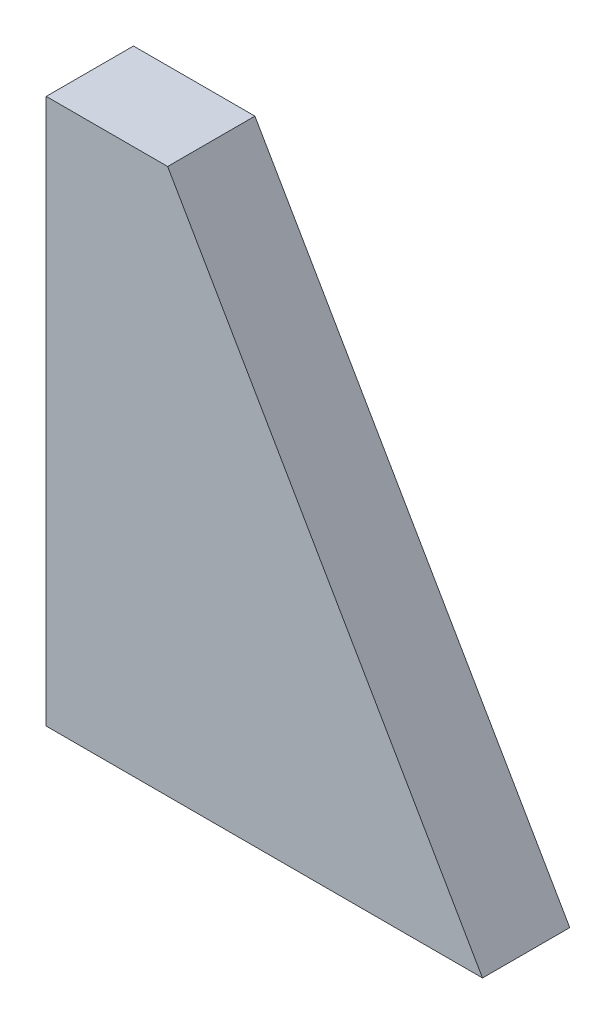
ISO-10303-21;
HEADER;
FILE_DESCRIPTION(('STEP AP214'),'2;1');
FILE_NAME('part.step','',(''),(''),'','','');
FILE_SCHEMA(('AUTOMOTIVE_DESIGN { 1 0 10303 214 1 1 1 1 }'));
ENDSEC;
DATA;
#1=APPLICATION_CONTEXT('core data for automotive mechanical design processes');
#2=APPLICATION_PROTOCOL_DEFINITION('international standard','automotive_design',2000,#1);
#3=PRODUCT_CONTEXT('',#1,'mechanical');
#4=PRODUCT('Part','Part','',(#3));
#5=PRODUCT_RELATED_PRODUCT_CATEGORY('part','',(#4));
#6=PRODUCT_DEFINITION_FORMATION('','',#4);
#7=PRODUCT_DEFINITION_CONTEXT('part definition',#1,'design');
#8=PRODUCT_DEFINITION('design','',#6,#7);
#9=PRODUCT_DEFINITION_SHAPE('','',#8);
#10=(LENGTH_UNIT() NAMED_UNIT(*) SI_UNIT(.MILLI.,.METRE.));
#11=(NAMED_UNIT(*) PLANE_ANGLE_UNIT() SI_UNIT($,.RADIAN.));
#12=(NAMED_UNIT(*) SI_UNIT($,.STERADIAN.) SOLID_ANGLE_UNIT());
#13=UNCERTAINTY_MEASURE_WITH_UNIT(LENGTH_MEASURE(1.E-05),#10,'distance_accuracy_value','');
#14=(GEOMETRIC_REPRESENTATION_CONTEXT(3) GLOBAL_UNCERTAINTY_ASSIGNED_CONTEXT((#13)) GLOBAL_UNIT_ASSIGNED_CONTEXT((#10,
#11,#12)) REPRESENTATION_CONTEXT('',''));
#15=CARTESIAN_POINT('',(0.,0.,0.));
#16=DIRECTION('',(0.,0.,1.));
#17=DIRECTION('',(1.,0.,0.));
#18=AXIS2_PLACEMENT_3D('',#15,#16,#17);
#19=CARTESIAN_POINT('',(0.,25.,8.));
#20=DIRECTION('',(0.,1.,0.));
#21=DIRECTION('',(0.,0.,1.));
#22=AXIS2_PLACEMENT_3D('',#19,#20,#21);
#23=PLANE('',#22);
#24=DIRECTION('',(1.,0.,0.));
#25=VECTOR('',#24,1.);
#26=CARTESIAN_POINT('',(0.,25.,0.));
#27=LINE('',#26,#25);
#28=CARTESIAN_POINT('',(-20.,25.,0.));
#29=VERTEX_POINT('',#28);
#30=CARTESIAN_POINT('',(-8.86751345948268,25.,0.));
#31=VERTEX_POINT('',#30);
#32=EDGE_CURVE('E98',#29,#31,#27,.T.);
#33=ORIENTED_EDGE('',*,*,#32,.F.);
#34=DIRECTION('',(0.,0.,-1.));
#35=VECTOR('',#34,1.);
#36=CARTESIAN_POINT('',(-20.,25.,8.));
#37=LINE('',#36,#35);
#38=CARTESIAN_POINT('',(-20.,25.,8.));
#39=VERTEX_POINT('',#38);
#40=EDGE_CURVE('E11',#39,#29,#37,.T.);
#41=ORIENTED_EDGE('',*,*,#40,.F.);
#42=DIRECTION('',(1.,0.,0.));
#43=VECTOR('',#42,1.);
#44=CARTESIAN_POINT('',(0.,25.,8.));
#45=LINE('',#44,#43);
#46=CARTESIAN_POINT('',(-8.86751345948268,25.,8.));
#47=VERTEX_POINT('',#46);
#48=EDGE_CURVE('E92',#39,#47,#45,.T.);
#49=ORIENTED_EDGE('',*,*,#48,.T.);
#50=DIRECTION('',(0.,0.,-1.));
#51=VECTOR('',#50,1.);
#52=CARTESIAN_POINT('',(-8.86751345948268,25.,8.));
#53=LINE('',#52,#51);
#54=EDGE_CURVE('E73',#47,#31,#53,.T.);
#55=ORIENTED_EDGE('',*,*,#54,.T.);
#56=EDGE_LOOP('',(#33,#41,#49,#55));
#57=FACE_BOUND('',#56,.T.);
#58=ADVANCED_FACE('F35',(#57),#23,.T.);
#59=CARTESIAN_POINT('',(-20.,0.,8.));
#60=DIRECTION('',(-1.,0.,0.));
#61=DIRECTION('',(0.,0.,1.));
#62=AXIS2_PLACEMENT_3D('',#59,#60,#61);
#63=PLANE('',#62);
#64=DIRECTION('',(0.,1.,0.));
#65=VECTOR('',#64,1.);
#66=CARTESIAN_POINT('',(-20.,0.,0.));
#67=LINE('',#66,#65);
#68=CARTESIAN_POINT('',(-20.,-25.,0.));
#69=VERTEX_POINT('',#68);
#70=EDGE_CURVE('E86',#69,#29,#67,.T.);
#71=ORIENTED_EDGE('',*,*,#70,.F.);
#72=DIRECTION('',(0.,0.,-1.));
#73=VECTOR('',#72,1.);
#74=CARTESIAN_POINT('',(-20.,-25.,8.));
#75=LINE('',#74,#73);
#76=CARTESIAN_POINT('',(-20.,-25.,8.));
#77=VERTEX_POINT('',#76);
#78=EDGE_CURVE('E43',#77,#69,#75,.T.);
#79=ORIENTED_EDGE('',*,*,#78,.F.);
#80=DIRECTION('',(0.,1.,0.));
#81=VECTOR('',#80,1.);
#82=CARTESIAN_POINT('',(-20.,0.,8.));
#83=LINE('',#82,#81);
#84=EDGE_CURVE('E84',#77,#39,#83,.T.);
#85=ORIENTED_EDGE('',*,*,#84,.T.);
#86=ORIENTED_EDGE('',*,*,#40,.T.);
#87=EDGE_LOOP('',(#71,#79,#85,#86));
#88=FACE_BOUND('',#87,.T.);
#89=ADVANCED_FACE('F82',(#88),#63,.T.);
#90=CARTESIAN_POINT('',(0.,-25.,8.));
#91=DIRECTION('',(0.,1.,0.));
#92=DIRECTION('',(0.,0.,1.));
#93=AXIS2_PLACEMENT_3D('',#90,#91,#92);
#94=PLANE('',#93);
#95=DIRECTION('',(1.,0.,0.));
#96=VECTOR('',#95,1.);
#97=CARTESIAN_POINT('',(0.,-25.,0.));
#98=LINE('',#97,#96);
#99=CARTESIAN_POINT('',(20.,-25.,0.));
#100=VERTEX_POINT('',#99);
#101=EDGE_CURVE('E66',#69,#100,#98,.T.);
#102=ORIENTED_EDGE('',*,*,#101,.T.);
#103=DIRECTION('',(0.,0.,-1.));
#104=VECTOR('',#103,1.);
#105=CARTESIAN_POINT('',(20.,-25.,8.));
#106=LINE('',#105,#104);
#107=CARTESIAN_POINT('',(20.,-25.,8.));
#108=VERTEX_POINT('',#107);
#109=EDGE_CURVE('E87',#108,#100,#106,.T.);
#110=ORIENTED_EDGE('',*,*,#109,.F.);
#111=DIRECTION('',(1.,0.,0.));
#112=VECTOR('',#111,1.);
#113=CARTESIAN_POINT('',(0.,-25.,8.));
#114=LINE('',#113,#112);
#115=EDGE_CURVE('E88',#77,#108,#114,.T.);
#116=ORIENTED_EDGE('',*,*,#115,.F.);
#117=ORIENTED_EDGE('',*,*,#78,.T.);
#118=EDGE_LOOP('',(#102,#110,#116,#117));
#119=FACE_BOUND('',#118,.T.);
#120=ADVANCED_FACE('F89',(#119),#94,.F.);
#121=CARTESIAN_POINT('',(4.17468245269389,2.41025403784414,8.));
#122=DIRECTION('',(-0.866025403784428,-0.500000000000018,0.));
#123=DIRECTION('',(0.500000000000018,-0.866025403784428,0.));
#124=AXIS2_PLACEMENT_3D('',#121,#122,#123);
#125=PLANE('',#124);
#126=DIRECTION('',(-0.500000000000018,0.866025403784428,0.));
#127=VECTOR('',#126,1.);
#128=CARTESIAN_POINT('',(4.17468245269389,2.41025403784414,0.));
#129=LINE('',#128,#127);
#130=EDGE_CURVE('E94',#100,#31,#129,.T.);
#131=ORIENTED_EDGE('',*,*,#130,.T.);
#132=ORIENTED_EDGE('',*,*,#54,.F.);
#133=DIRECTION('',(-0.500000000000018,0.866025403784428,0.));
#134=VECTOR('',#133,1.);
#135=CARTESIAN_POINT('',(4.17468245269389,2.41025403784414,8.));
#136=LINE('',#135,#134);
#137=EDGE_CURVE('E51',#108,#47,#136,.T.);
#138=ORIENTED_EDGE('',*,*,#137,.F.);
#139=ORIENTED_EDGE('',*,*,#109,.T.);
#140=EDGE_LOOP('',(#131,#132,#138,#139));
#141=FACE_BOUND('',#140,.T.);
#142=ADVANCED_FACE('F107',(#141),#125,.F.);
#143=CARTESIAN_POINT('',(0.,0.,8.));
#144=DIRECTION('',(0.,0.,1.));
#145=DIRECTION('',(1.,0.,0.));
#146=AXIS2_PLACEMENT_3D('',#143,#144,#145);
#147=PLANE('',#146);
#148=ORIENTED_EDGE('',*,*,#48,.F.);
#149=ORIENTED_EDGE('',*,*,#84,.F.);
#150=ORIENTED_EDGE('',*,*,#115,.T.);
#151=ORIENTED_EDGE('',*,*,#137,.T.);
#152=EDGE_LOOP('',(#148,#149,#150,#151));
#153=FACE_BOUND('',#152,.T.);
#154=ADVANCED_FACE('F91',(#153),#147,.T.);
#155=CARTESIAN_POINT('',(0.,0.,0.));
#156=DIRECTION('',(0.,0.,1.));
#157=DIRECTION('',(1.,0.,0.));
#158=AXIS2_PLACEMENT_3D('',#155,#156,#157);
#159=PLANE('',#158);
#160=ORIENTED_EDGE('',*,*,#32,.T.);
#161=ORIENTED_EDGE('',*,*,#130,.F.);
#162=ORIENTED_EDGE('',*,*,#101,.F.);
#163=ORIENTED_EDGE('',*,*,#70,.T.);
#164=EDGE_LOOP('',(#160,#161,#162,#163));
#165=FACE_BOUND('',#164,.T.);
#166=ADVANCED_FACE('F109',(#165),#159,.F.);
#167=CLOSED_SHELL('',(#58,#89,#120,#142,#154,#166));
#168=MANIFOLD_SOLID_BREP('B2',#167);
#169=ADVANCED_BREP_SHAPE_REPRESENTATION('',(#18,#168),#14);
#170=SHAPE_DEFINITION_REPRESENTATION(#9,#169);
ENDSEC;
END-ISO-10303-21;
